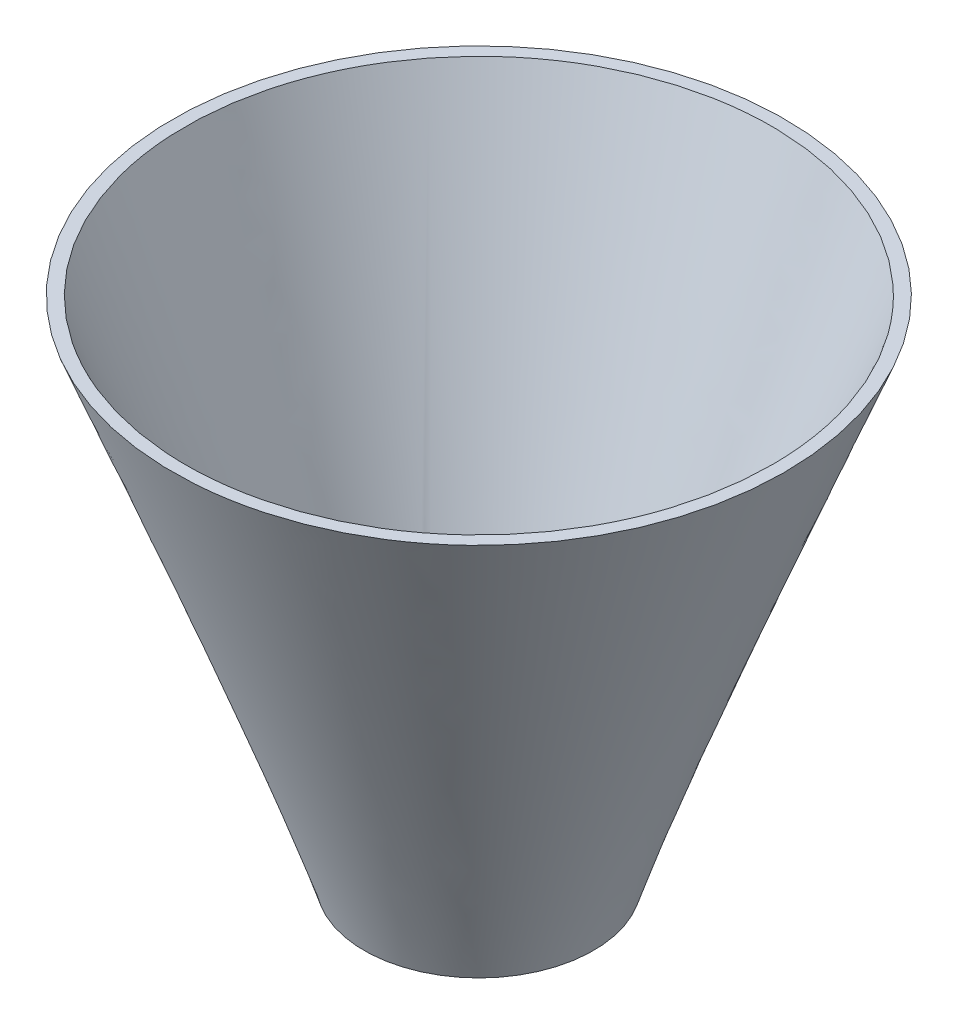
ISO-10303-21;
HEADER;
FILE_DESCRIPTION(('STEP AP214'),'2;1');
FILE_NAME('part.step','',(''),(''),'','','');
FILE_SCHEMA(('AUTOMOTIVE_DESIGN { 1 0 10303 214 1 1 1 1 }'));
ENDSEC;
DATA;
#1=APPLICATION_CONTEXT('core data for automotive mechanical design processes');
#2=APPLICATION_PROTOCOL_DEFINITION('international standard','automotive_design',2000,#1);
#3=PRODUCT_CONTEXT('',#1,'mechanical');
#4=PRODUCT('Part','Part','',(#3));
#5=PRODUCT_RELATED_PRODUCT_CATEGORY('part','',(#4));
#6=PRODUCT_DEFINITION_FORMATION('','',#4);
#7=PRODUCT_DEFINITION_CONTEXT('part definition',#1,'design');
#8=PRODUCT_DEFINITION('design','',#6,#7);
#9=PRODUCT_DEFINITION_SHAPE('','',#8);
#10=(LENGTH_UNIT() NAMED_UNIT(*) SI_UNIT(.MILLI.,.METRE.));
#11=(NAMED_UNIT(*) PLANE_ANGLE_UNIT() SI_UNIT($,.RADIAN.));
#12=(NAMED_UNIT(*) SI_UNIT($,.STERADIAN.) SOLID_ANGLE_UNIT());
#13=UNCERTAINTY_MEASURE_WITH_UNIT(LENGTH_MEASURE(1.E-05),#10,'distance_accuracy_value','');
#14=(GEOMETRIC_REPRESENTATION_CONTEXT(3) GLOBAL_UNCERTAINTY_ASSIGNED_CONTEXT((#13)) GLOBAL_UNIT_ASSIGNED_CONTEXT((#10,
#11,#12)) REPRESENTATION_CONTEXT('',''));
#15=CARTESIAN_POINT('',(0.,0.,0.));
#16=DIRECTION('',(0.,0.,1.));
#17=DIRECTION('',(1.,0.,0.));
#18=AXIS2_PLACEMENT_3D('',#15,#16,#17);
#19=CARTESIAN_POINT('',(0.,0.,0.));
#20=DIRECTION('',(0.,1.,0.));
#21=DIRECTION('',(0.,0.,1.));
#22=AXIS2_PLACEMENT_3D('',#19,#20,#21);
#23=PLANE('',#22);
#24=CARTESIAN_POINT('',(0.,0.,0.));
#25=DIRECTION('',(0.,-1.,0.));
#26=DIRECTION('',(0.,0.,-1.));
#27=AXIS2_PLACEMENT_3D('',#24,#25,#26);
#28=CIRCLE('',#27,8.1);
#29=CARTESIAN_POINT('',(-7.51800205442449,0.,-3.01490383091553));
#30=VERTEX_POINT('',#29);
#31=EDGE_CURVE('E129',#30,#30,#28,.T.);
#32=ORIENTED_EDGE('',*,*,#31,.F.);
#33=EDGE_LOOP('',(#32));
#34=FACE_BOUND('',#33,.T.);
#35=CARTESIAN_POINT('',(0.,0.,0.));
#36=DIRECTION('',(0.,1.,0.));
#37=DIRECTION('',(0.,0.,1.));
#38=AXIS2_PLACEMENT_3D('',#35,#36,#37);
#39=CIRCLE('',#38,9.);
#40=CARTESIAN_POINT('',(-6.77338938317824,0.,-5.92631388502569));
#41=VERTEX_POINT('',#40);
#42=EDGE_CURVE('E11',#41,#41,#39,.T.);
#43=ORIENTED_EDGE('',*,*,#42,.F.);
#44=EDGE_LOOP('',(#43));
#45=FACE_BOUND('',#44,.T.);
#46=ADVANCED_FACE('F47',(#34,#45),#23,.F.);
#47=CARTESIAN_POINT('',(0.,40.,0.));
#48=DIRECTION('',(0.,1.,0.));
#49=DIRECTION('',(0.,0.,1.));
#50=AXIS2_PLACEMENT_3D('',#47,#48,#49);
#51=PLANE('',#50);
#52=CARTESIAN_POINT('',(0.,40.,0.));
#53=DIRECTION('',(0.,1.,0.));
#54=DIRECTION('',(0.,0.,1.));
#55=AXIS2_PLACEMENT_3D('',#52,#53,#54);
#56=CIRCLE('',#55,23.);
#57=CARTESIAN_POINT('',(-18.1024774370267,40.,-14.1880340654348));
#58=VERTEX_POINT('',#57);
#59=EDGE_CURVE('E63',#58,#58,#56,.T.);
#60=ORIENTED_EDGE('',*,*,#59,.F.);
#61=EDGE_LOOP('',(#60));
#62=FACE_BOUND('',#61,.T.);
#63=CARTESIAN_POINT('',(0.,40.,0.));
#64=DIRECTION('',(0.,1.,0.));
#65=DIRECTION('',(0.,0.,1.));
#66=AXIS2_PLACEMENT_3D('',#63,#64,#65);
#67=CIRCLE('',#66,24.);
#68=CARTESIAN_POINT('',(-9.76627120000555,40.,-21.9230460212066));
#69=VERTEX_POINT('',#68);
#70=EDGE_CURVE('E56',#69,#69,#67,.T.);
#71=ORIENTED_EDGE('',*,*,#70,.T.);
#72=EDGE_LOOP('',(#71));
#73=FACE_BOUND('',#72,.T.);
#74=ADVANCED_FACE('F83',(#62,#73),#51,.T.);
#75=CARTESIAN_POINT('',(-9.76627120000555,40.,-21.9230460212066));
#76=CARTESIAN_POINT('',(-6.77338938317824,0.,-5.92631388502569));
#77=CARTESIAN_POINT('',(34.0798208424076,40.,-41.4555884212177));
#78=CARTESIAN_POINT('',(5.07923838687315,0.,-19.4730926513822));
#79=CARTESIAN_POINT('',(53.6123632424187,40.,2.39050362119549));
#80=CARTESIAN_POINT('',(18.6260171532296,0.,-7.62046488133078));
#81=CARTESIAN_POINT('',(9.76627120000555,40.,21.9230460212066));
#82=CARTESIAN_POINT('',(6.77338938317824,0.,5.92631388502569));
#83=CARTESIAN_POINT('',(-34.0798208424076,40.,41.4555884212177));
#84=CARTESIAN_POINT('',(-5.07923838687314,0.,19.4730926513822));
#85=CARTESIAN_POINT('',(-53.6123632424187,40.,-2.39050362119549));
#86=CARTESIAN_POINT('',(-18.6260171532296,0.,7.62046488133078));
#87=CARTESIAN_POINT('',(-9.76627120000555,40.,-21.9230460212066));
#88=CARTESIAN_POINT('',(-6.77338938317824,0.,-5.92631388502569));
#89=(BOUNDED_SURFACE() B_SPLINE_SURFACE(3,1,((#75,#76),(#77,#78),(#79,#80),(#81,#82),(#83,#84),
(#85,#86),(#87,#88)),.UNSPECIFIED.,.T.,.F.,.F.) B_SPLINE_SURFACE_WITH_KNOTS((4,3,4),(2,2),(0.,
0.5,1.),(0.,1.),.UNSPECIFIED.) GEOMETRIC_REPRESENTATION_ITEM() RATIONAL_B_SPLINE_SURFACE(((1.,
1.),(0.333333333333333,0.333333333333333),(0.333333333333333,0.333333333333333),(1.,1.),
(0.333333333333334,0.333333333333334),(0.333333333333334,0.333333333333334),(1.,1.))) REPRESENTATION_ITEM('') SURFACE());
#90=CARTESIAN_POINT('',(-9.76627120000555,40.,-21.9230460212066));
#91=CARTESIAN_POINT('',(-9.73509534774693,39.5833333333333,-21.756413394788));
#92=CARTESIAN_POINT('',(-9.70391949548831,39.1666666666667,-21.5897807683695));
#93=CARTESIAN_POINT('',(-9.64156779097108,38.3333333333333,-21.2565155155324));
#94=CARTESIAN_POINT('',(-9.61039193871246,37.9166666666667,-21.0898828891138));
#95=CARTESIAN_POINT('',(-9.54804023419522,37.0833333333333,-20.7566176362767));
#96=CARTESIAN_POINT('',(-9.5168643819366,36.6666666666667,-20.5899850098582));
#97=CARTESIAN_POINT('',(-9.45451267741937,35.8333333333333,-20.2567197570211));
#98=CARTESIAN_POINT('',(-9.42333682516075,35.4166666666667,-20.0900871306025));
#99=CARTESIAN_POINT('',(-9.36098512064352,34.5833333333333,-19.7568218777654));
#100=CARTESIAN_POINT('',(-9.3298092683849,34.1666666666667,-19.5901892513469));
#101=CARTESIAN_POINT('',(-9.26745756386766,33.3333333333333,-19.2569239985098));
#102=CARTESIAN_POINT('',(-9.23628171160905,32.9166666666667,-19.0902913720912));
#103=CARTESIAN_POINT('',(-9.17393000709181,32.0833333333333,-18.7570261192541));
#104=CARTESIAN_POINT('',(-9.14275415483319,31.6666666666667,-18.5903934928356));
#105=CARTESIAN_POINT('',(-9.08040245031596,30.8333333333333,-18.2571282399985));
#106=CARTESIAN_POINT('',(-9.04922659805734,30.4166666666667,-18.0904956135799));
#107=CARTESIAN_POINT('',(-8.9868748935401,29.5833333333333,-17.7572303607428));
#108=CARTESIAN_POINT('',(-8.95569904128148,29.1666666666667,-17.5905977343243));
#109=CARTESIAN_POINT('',(-8.89334733676425,28.3333333333333,-17.2573324814872));
#110=CARTESIAN_POINT('',(-8.86217148450563,27.9166666666667,-17.0906998550686));
#111=CARTESIAN_POINT('',(-8.7998197799884,27.0833333333333,-16.7574346022315));
#112=CARTESIAN_POINT('',(-8.76864392772978,26.6666666666667,-16.590801975813));
#113=CARTESIAN_POINT('',(-8.70629222321254,25.8333333333333,-16.2575367229759));
#114=CARTESIAN_POINT('',(-8.67511637095392,25.4166666666667,-16.0909040965573));
#115=CARTESIAN_POINT('',(-8.61276466643669,24.5833333333333,-15.7576388437202));
#116=CARTESIAN_POINT('',(-8.58158881417807,24.1666666666667,-15.5910062173017));
#117=CARTESIAN_POINT('',(-8.51923710966084,23.3333333333333,-15.2577409644646));
#118=CARTESIAN_POINT('',(-8.48806125740222,22.9166666666667,-15.091108338046));
#119=CARTESIAN_POINT('',(-8.42570955288498,22.0833333333333,-14.7578430852089));
#120=CARTESIAN_POINT('',(-8.39453370062636,21.6666666666667,-14.5912104587903));
#121=CARTESIAN_POINT('',(-8.33218199610913,20.8333333333333,-14.2579452059532));
#122=CARTESIAN_POINT('',(-8.30100614385051,20.4166666666667,-14.0913125795347));
#123=CARTESIAN_POINT('',(-8.23865443933327,19.5833333333333,-13.7580473266976));
#124=CARTESIAN_POINT('',(-8.20747858707466,19.1666666666667,-13.591414700279));
#125=CARTESIAN_POINT('',(-8.14512688255742,18.3333333333333,-13.2581494474419));
#126=CARTESIAN_POINT('',(-8.1139510302988,17.9166666666667,-13.0915168210234));
#127=CARTESIAN_POINT('',(-8.05159932578157,17.0833333333333,-12.7582515681863));
#128=CARTESIAN_POINT('',(-8.02042347352295,16.6666666666667,-12.5916189417677));
#129=CARTESIAN_POINT('',(-7.95807176900572,15.8333333333333,-12.2583536889306));
#130=CARTESIAN_POINT('',(-7.9268959167471,15.4166666666667,-12.0917210625121));
#131=CARTESIAN_POINT('',(-7.86454421222986,14.5833333333333,-11.758455809675));
#132=CARTESIAN_POINT('',(-7.83336835997124,14.1666666666667,-11.5918231832564));
#133=CARTESIAN_POINT('',(-7.77101665545401,13.3333333333333,-11.2585579304193));
#134=CARTESIAN_POINT('',(-7.73984080319539,12.9166666666667,-11.0919253040008));
#135=CARTESIAN_POINT('',(-7.67748909867815,12.0833333333333,-10.7586600511637));
#136=CARTESIAN_POINT('',(-7.64631324641954,11.6666666666667,-10.5920274247451));
#137=CARTESIAN_POINT('',(-7.5839615419023,10.8333333333333,-10.258762171908));
#138=CARTESIAN_POINT('',(-7.55278568964368,10.4166666666667,-10.0921295454895));
#139=CARTESIAN_POINT('',(-7.49043398512645,9.58333333333333,-9.75886429265237));
#140=CARTESIAN_POINT('',(-7.45925813286783,9.16666666666667,-9.59223166623382));
#141=CARTESIAN_POINT('',(-7.39690642835059,8.33333333333333,-9.25896641339672));
#142=CARTESIAN_POINT('',(-7.36573057609198,7.91666666666667,-9.09233378697816));
#143=CARTESIAN_POINT('',(-7.30337887157474,7.08333333333333,-8.75906853414106));
#144=CARTESIAN_POINT('',(-7.27220301931612,6.66666666666667,-8.59243590772251));
#145=CARTESIAN_POINT('',(-7.20985131479889,5.83333333333333,-8.25917065488541));
#146=CARTESIAN_POINT('',(-7.17867546254027,5.41666666666667,-8.09253802846686));
#147=CARTESIAN_POINT('',(-7.11632375802303,4.58333333333333,-7.75927277562976));
#148=CARTESIAN_POINT('',(-7.08514790576441,4.16666666666667,-7.5926401492112));
#149=CARTESIAN_POINT('',(-7.02279620124718,3.33333333333333,-7.2593748963741));
#150=CARTESIAN_POINT('',(-6.99162034898856,2.91666666666667,-7.09274226995555));
#151=CARTESIAN_POINT('',(-6.92926864447133,2.08333333333333,-6.75947701711845));
#152=CARTESIAN_POINT('',(-6.89809279221271,1.66666666666667,-6.5928443906999));
#153=CARTESIAN_POINT('',(-6.83574108769547,0.833333333333333,-6.2595791378628));
#154=CARTESIAN_POINT('',(-6.80456523543686,0.416666666666666,-6.09294651144424));
#155=CARTESIAN_POINT('',(-6.77338938317824,0.,-5.92631388502569));
#156=B_SPLINE_CURVE_WITH_KNOTS('',3,(#90,#91,#92,#93,#94,#95,#96,#97,#98,#99,#100,#101,#102,
#103,#104,#105,#106,#107,#108,#109,#110,#111,#112,#113,#114,#115,#116,#117,#118,#119,#120,#121,
#122,#123,#124,#125,#126,#127,#128,#129,#130,#131,#132,#133,#134,#135,#136,#137,#138,#139,#140,
#141,#142,#143,#144,#145,#146,#147,#148,#149,#150,#151,#152,#153,#154,#155),.UNSPECIFIED.,.F.,
.F.,(4,2,2,2,2,2,2,2,2,2,2,2,2,2,2,2,2,2,2,2,2,2,2,2,2,2,2,2,2,2,2,2,4),(0.,1.34949816360037,
2.69899632720073,4.0484944908011,5.39799265440146,6.74749081800183,8.09698898160219,
9.44648714520256,10.7959853088029,12.1454834724033,13.4949816360037,14.844479799604,
16.1939779632044,17.5434761268048,18.8929742904051,20.2424724540055,21.5919706176059,
22.9414687812062,24.2909669448066,25.6404651084069,26.9899632720073,28.3394614356077,
29.6889595992081,31.0384577628084,32.3879559264088,33.7374540900092,35.0869522536095,
36.4364504172099,37.7859485808103,39.1354467444106,40.484944908011,41.8344430716114,
43.1839412352117),.UNSPECIFIED.);
#157=EDGE_CURVE('BSEAM92',#69,#41,#156,.T.);
#158=ORIENTED_EDGE('',*,*,#70,.F.);
#159=ORIENTED_EDGE('',*,*,#42,.T.);
#160=ORIENTED_EDGE('',*,*,#157,.T.);
#161=ORIENTED_EDGE('',*,*,#157,.F.);
#162=EDGE_LOOP('',(#158,#160,#159,#161));
#163=FACE_BOUND('',#162,.T.);
#164=ADVANCED_FACE('F92',(#163),#89,.T.);
#165=CARTESIAN_POINT('',(-7.51800205442449,0.,-3.01490383091553));
#166=CARTESIAN_POINT('',(-18.1024774370267,40.,-14.1880340654348));
#167=CARTESIAN_POINT('',(-13.5478097162556,0.,12.0211002779334));
#168=CARTESIAN_POINT('',(-46.4785455678964,40.,22.0169208086186));
#169=CARTESIAN_POINT('',(1.48819439259343,0.,18.0509079397645));
#170=CARTESIAN_POINT('',(-10.273590693843,40.,50.3929889394882));
#171=CARTESIAN_POINT('',(7.51800205442449,0.,3.01490383091553));
#172=CARTESIAN_POINT('',(18.1024774370267,40.,14.1880340654348));
#173=CARTESIAN_POINT('',(13.5478097162555,0.,-12.0211002779334));
#174=CARTESIAN_POINT('',(46.4785455678964,40.,-22.0169208086186));
#175=CARTESIAN_POINT('',(-1.48819439259342,0.,-18.0509079397645));
#176=CARTESIAN_POINT('',(10.273590693843,40.,-50.3929889394882));
#177=CARTESIAN_POINT('',(-7.51800205442449,0.,-3.01490383091553));
#178=CARTESIAN_POINT('',(-18.1024774370267,40.,-14.1880340654348));
#179=(BOUNDED_SURFACE() B_SPLINE_SURFACE(3,1,((#165,#166),(#167,#168),(#169,#170),(#171,#172),
(#173,#174),(#175,#176),(#177,#178)),.UNSPECIFIED.,.T.,.F.,.F.) B_SPLINE_SURFACE_WITH_KNOTS((4,
3,4),(2,2),(0.,0.5,1.),(0.,1.),
.UNSPECIFIED.) GEOMETRIC_REPRESENTATION_ITEM() RATIONAL_B_SPLINE_SURFACE(((1.,1.),
(0.333333333333333,0.333333333333333),(0.333333333333333,0.333333333333333),(1.,1.),
(0.333333333333334,0.333333333333333),(0.333333333333334,0.333333333333333),(1.,1.))) REPRESENTATION_ITEM('') SURFACE());
#180=CARTESIAN_POINT('',(-7.51800205442449,0.,-3.01490383091553));
#181=CARTESIAN_POINT('',(-7.6282570063266,0.416666666666667,-3.13129060419177));
#182=CARTESIAN_POINT('',(-7.7385119582287,0.833333333333333,-3.24767737746802));
#183=CARTESIAN_POINT('',(-7.95902186203292,1.66666666666667,-3.4804509240205));
#184=CARTESIAN_POINT('',(-8.06927681393502,2.08333333333333,-3.59683769729674));
#185=CARTESIAN_POINT('',(-8.28978671773923,2.91666666666667,-3.82961124384923));
#186=CARTESIAN_POINT('',(-8.40004166964134,3.33333333333333,-3.94599801712547));
#187=CARTESIAN_POINT('',(-8.62055157344555,4.16666666666667,-4.17877156367796));
#188=CARTESIAN_POINT('',(-8.73080652534766,4.58333333333333,-4.2951583369542));
#189=CARTESIAN_POINT('',(-8.95131642915187,5.41666666666667,-4.52793188350669));
#190=CARTESIAN_POINT('',(-9.06157138105398,5.83333333333333,-4.64431865678293));
#191=CARTESIAN_POINT('',(-9.28208128485819,6.66666666666667,-4.87709220333542));
#192=CARTESIAN_POINT('',(-9.3923362367603,7.08333333333333,-4.99347897661166));
#193=CARTESIAN_POINT('',(-9.61284614056451,7.91666666666667,-5.22625252316414));
#194=CARTESIAN_POINT('',(-9.72310109246662,8.33333333333333,-5.34263929644039));
#195=CARTESIAN_POINT('',(-9.94361099627083,9.16666666666667,-5.57541284299287));
#196=CARTESIAN_POINT('',(-10.0538659481729,9.58333333333333,-5.69179961626911));
#197=CARTESIAN_POINT('',(-10.2743758519771,10.4166666666667,-5.9245731628216));
#198=CARTESIAN_POINT('',(-10.3846308038793,10.8333333333333,-6.04095993609784));
#199=CARTESIAN_POINT('',(-10.6051407076835,11.6666666666667,-6.27373348265033));
#200=CARTESIAN_POINT('',(-10.7153956595856,12.0833333333333,-6.39012025592657));
#201=CARTESIAN_POINT('',(-10.9359055633898,12.9166666666667,-6.62289380247906));
#202=CARTESIAN_POINT('',(-11.0461605152919,13.3333333333333,-6.7392805757553));
#203=CARTESIAN_POINT('',(-11.2666704190961,14.1666666666667,-6.97205412230778));
#204=CARTESIAN_POINT('',(-11.3769253709982,14.5833333333333,-7.08844089558403));
#205=CARTESIAN_POINT('',(-11.5974352748024,15.4166666666667,-7.32121444213651));
#206=CARTESIAN_POINT('',(-11.7076902267045,15.8333333333333,-7.43760121541276));
#207=CARTESIAN_POINT('',(-11.9282001305087,16.6666666666667,-7.67037476196524));
#208=CARTESIAN_POINT('',(-12.0384550824108,17.0833333333333,-7.78676153524148));
#209=CARTESIAN_POINT('',(-12.2589649862151,17.9166666666667,-8.01953508179397));
#210=CARTESIAN_POINT('',(-12.3692199381172,18.3333333333333,-8.13592185507021));
#211=CARTESIAN_POINT('',(-12.5897298419214,19.1666666666667,-8.3686954016227));
#212=CARTESIAN_POINT('',(-12.6999847938235,19.5833333333333,-8.48508217489894));
#213=CARTESIAN_POINT('',(-12.9204946976277,20.4166666666667,-8.71785572145142));
#214=CARTESIAN_POINT('',(-13.0307496495298,20.8333333333333,-8.83424249472767));
#215=CARTESIAN_POINT('',(-13.251259553334,21.6666666666667,-9.06701604128015));
#216=CARTESIAN_POINT('',(-13.3615145052361,22.0833333333333,-9.1834028145564));
#217=CARTESIAN_POINT('',(-13.5820244090403,22.9166666666667,-9.41617636110888));
#218=CARTESIAN_POINT('',(-13.6922793609424,23.3333333333333,-9.53256313438512));
#219=CARTESIAN_POINT('',(-13.9127892647467,24.1666666666667,-9.76533668093761));
#220=CARTESIAN_POINT('',(-14.0230442166488,24.5833333333333,-9.88172345421385));
#221=CARTESIAN_POINT('',(-14.243554120453,25.4166666666667,-10.1144970007663));
#222=CARTESIAN_POINT('',(-14.3538090723551,25.8333333333333,-10.2308837740426));
#223=CARTESIAN_POINT('',(-14.5743189761593,26.6666666666667,-10.4636573205951));
#224=CARTESIAN_POINT('',(-14.6845739280614,27.0833333333333,-10.5800440938713));
#225=CARTESIAN_POINT('',(-14.9050838318656,27.9166666666667,-10.8128176404238));
#226=CARTESIAN_POINT('',(-15.0153387837677,28.3333333333333,-10.9292044137));
#227=CARTESIAN_POINT('',(-15.2358486875719,29.1666666666667,-11.1619779602525));
#228=CARTESIAN_POINT('',(-15.346103639474,29.5833333333333,-11.2783647335288));
#229=CARTESIAN_POINT('',(-15.5666135432783,30.4166666666667,-11.5111382800812));
#230=CARTESIAN_POINT('',(-15.6768684951804,30.8333333333333,-11.6275250533575));
#231=CARTESIAN_POINT('',(-15.8973783989846,31.6666666666667,-11.86029859991));
#232=CARTESIAN_POINT('',(-16.0076333508867,32.0833333333333,-11.9766853731862));
#233=CARTESIAN_POINT('',(-16.2281432546909,32.9166666666667,-12.2094589197387));
#234=CARTESIAN_POINT('',(-16.338398206593,33.3333333333333,-12.3258456930149));
#235=CARTESIAN_POINT('',(-16.5589081103972,34.1666666666667,-12.5586192395674));
#236=CARTESIAN_POINT('',(-16.6691630622993,34.5833333333333,-12.6750060128437));
#237=CARTESIAN_POINT('',(-16.8896729661035,35.4166666666667,-12.9077795593962));
#238=CARTESIAN_POINT('',(-16.9999279180056,35.8333333333333,-13.0241663326724));
#239=CARTESIAN_POINT('',(-17.2204378218098,36.6666666666667,-13.2569398792249));
#240=CARTESIAN_POINT('',(-17.330692773712,37.0833333333333,-13.3733266525011));
#241=CARTESIAN_POINT('',(-17.5512026775162,37.9166666666667,-13.6061001990536));
#242=CARTESIAN_POINT('',(-17.6614576294183,38.3333333333333,-13.7224869723299));
#243=CARTESIAN_POINT('',(-17.8819675332225,39.1666666666667,-13.9552605188823));
#244=CARTESIAN_POINT('',(-17.9922224851246,39.5833333333333,-14.0716472921586));
#245=CARTESIAN_POINT('',(-18.1024774370267,40.,-14.1880340654348));
#246=B_SPLINE_CURVE_WITH_KNOTS('',3,(#180,#181,#182,#183,#184,#185,#186,#187,#188,#189,#190,
#191,#192,#193,#194,#195,#196,#197,#198,#199,#200,#201,#202,#203,#204,#205,#206,#207,#208,#209,
#210,#211,#212,#213,#214,#215,#216,#217,#218,#219,#220,#221,#222,#223,#224,#225,#226,#227,#228,
#229,#230,#231,#232,#233,#234,#235,#236,#237,#238,#239,#240,#241,#242,#243,#244,#245),
.UNSPECIFIED.,.F.,.F.,(4,2,2,2,2,2,2,2,2,2,2,2,2,2,2,2,2,2,2,2,2,2,2,2,2,2,2,2,2,2,2,2,4),(0.,
1.33933502855459,2.67867005710918,4.01800508566377,5.35734011421836,6.69667514277295,
8.03601017132753,9.37534519988212,10.7146802284367,12.0540152569913,13.3933502855459,
14.7326853141005,16.0720203426551,17.4113553712097,18.7506903997642,20.0900254283188,
21.4293604568734,22.768695485428,24.1080305139826,25.4473655425372,26.7867005710918,
28.1260355996464,29.465370628201,30.8047056567555,32.1440406853101,33.4833757138647,
34.8227107424193,36.1620457709739,37.5013807995285,38.8407158280831,40.1800508566377,
41.5193858851923,42.8587209137469),.UNSPECIFIED.);
#247=EDGE_CURVE('BSEAM94',#30,#58,#246,.T.);
#248=ORIENTED_EDGE('',*,*,#31,.T.);
#249=ORIENTED_EDGE('',*,*,#59,.T.);
#250=ORIENTED_EDGE('',*,*,#247,.T.);
#251=ORIENTED_EDGE('',*,*,#247,.F.);
#252=EDGE_LOOP('',(#248,#250,#249,#251));
#253=FACE_BOUND('',#252,.T.);
#254=ADVANCED_FACE('F94',(#253),#179,.F.);
#255=CLOSED_SHELL('',(#46,#74,#164,#254));
#256=MANIFOLD_SOLID_BREP('B2',#255);
#257=ADVANCED_BREP_SHAPE_REPRESENTATION('',(#18,#256),#14);
#258=SHAPE_DEFINITION_REPRESENTATION(#9,#257);
ENDSEC;
END-ISO-10303-21;
